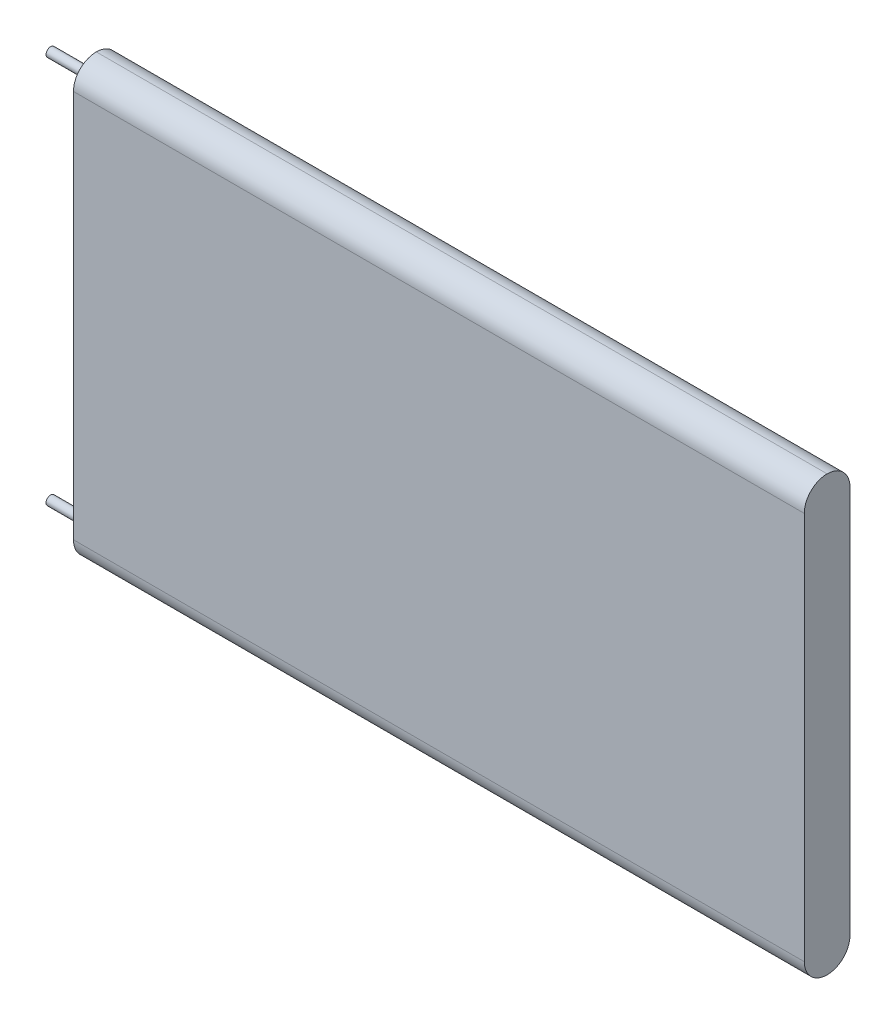
ISO-10303-21;
HEADER;
FILE_DESCRIPTION(('STEP AP214'),'2;1');
FILE_NAME('part.step','',(''),(''),'','','');
FILE_SCHEMA(('AUTOMOTIVE_DESIGN { 1 0 10303 214 1 1 1 1 }'));
ENDSEC;
DATA;
#1=APPLICATION_CONTEXT('core data for automotive mechanical design processes');
#2=APPLICATION_PROTOCOL_DEFINITION('international standard','automotive_design',2000,#1);
#3=PRODUCT_CONTEXT('',#1,'mechanical');
#4=PRODUCT('Part','Part','',(#3));
#5=PRODUCT_RELATED_PRODUCT_CATEGORY('part','',(#4));
#6=PRODUCT_DEFINITION_FORMATION('','',#4);
#7=PRODUCT_DEFINITION_CONTEXT('part definition',#1,'design');
#8=PRODUCT_DEFINITION('design','',#6,#7);
#9=PRODUCT_DEFINITION_SHAPE('','',#8);
#10=(LENGTH_UNIT() NAMED_UNIT(*) SI_UNIT(.MILLI.,.METRE.));
#11=(NAMED_UNIT(*) PLANE_ANGLE_UNIT() SI_UNIT($,.RADIAN.));
#12=(NAMED_UNIT(*) SI_UNIT($,.STERADIAN.) SOLID_ANGLE_UNIT());
#13=UNCERTAINTY_MEASURE_WITH_UNIT(LENGTH_MEASURE(1.E-05),#10,'distance_accuracy_value','');
#14=(GEOMETRIC_REPRESENTATION_CONTEXT(3) GLOBAL_UNCERTAINTY_ASSIGNED_CONTEXT((#13)) GLOBAL_UNIT_ASSIGNED_CONTEXT((#10,
#11,#12)) REPRESENTATION_CONTEXT('',''));
#15=CARTESIAN_POINT('',(0.,0.,0.));
#16=DIRECTION('',(0.,0.,1.));
#17=DIRECTION('',(1.,0.,0.));
#18=AXIS2_PLACEMENT_3D('',#15,#16,#17);
#19=CARTESIAN_POINT('',(50.8,-30.1625,6.35));
#20=DIRECTION('',(-1.,0.,0.));
#21=DIRECTION('',(0.,0.,1.));
#22=AXIS2_PLACEMENT_3D('',#19,#20,#21);
#23=PLANE('',#22);
#24=CARTESIAN_POINT('',(50.8,26.9875,3.175));
#25=DIRECTION('',(-1.,0.,0.));
#26=DIRECTION('',(0.,0.,1.));
#27=AXIS2_PLACEMENT_3D('',#24,#25,#26);
#28=CIRCLE('',#27,3.175);
#29=CARTESIAN_POINT('',(50.8,26.9875,0.));
#30=VERTEX_POINT('',#29);
#31=CARTESIAN_POINT('',(50.8,30.1625,3.175));
#32=VERTEX_POINT('',#31);
#33=EDGE_CURVE('E57',#30,#32,#28,.F.);
#34=ORIENTED_EDGE('',*,*,#33,.T.);
#35=CARTESIAN_POINT('',(50.8,26.9875,3.175));
#36=DIRECTION('',(-1.,0.,0.));
#37=DIRECTION('',(0.,0.,1.));
#38=AXIS2_PLACEMENT_3D('',#35,#36,#37);
#39=CIRCLE('',#38,3.175);
#40=CARTESIAN_POINT('',(50.8,26.9875,6.35));
#41=VERTEX_POINT('',#40);
#42=EDGE_CURVE('E108',#32,#41,#39,.F.);
#43=ORIENTED_EDGE('',*,*,#42,.T.);
#44=DIRECTION('',(0.,1.,0.));
#45=VECTOR('',#44,1.);
#46=CARTESIAN_POINT('',(50.8,-30.1625,6.35));
#47=LINE('',#46,#45);
#48=CARTESIAN_POINT('',(50.8,-26.9875,6.35));
#49=VERTEX_POINT('',#48);
#50=EDGE_CURVE('E101',#49,#41,#47,.T.);
#51=ORIENTED_EDGE('',*,*,#50,.F.);
#52=CARTESIAN_POINT('',(50.8,-26.9875,3.175));
#53=DIRECTION('',(-1.,0.,0.));
#54=DIRECTION('',(0.,0.,1.));
#55=AXIS2_PLACEMENT_3D('',#52,#53,#54);
#56=CIRCLE('',#55,3.175);
#57=CARTESIAN_POINT('',(50.8,-30.1625,3.175));
#58=VERTEX_POINT('',#57);
#59=EDGE_CURVE('E50',#49,#58,#56,.F.);
#60=ORIENTED_EDGE('',*,*,#59,.T.);
#61=CARTESIAN_POINT('',(50.8,-26.9875,3.175));
#62=DIRECTION('',(-1.,0.,0.));
#63=DIRECTION('',(0.,0.,1.));
#64=AXIS2_PLACEMENT_3D('',#61,#62,#63);
#65=CIRCLE('',#64,3.175);
#66=CARTESIAN_POINT('',(50.8,-26.9875,0.));
#67=VERTEX_POINT('',#66);
#68=EDGE_CURVE('E94',#58,#67,#65,.F.);
#69=ORIENTED_EDGE('',*,*,#68,.T.);
#70=DIRECTION('',(0.,1.,0.));
#71=VECTOR('',#70,1.);
#72=CARTESIAN_POINT('',(50.8,-30.1625,0.));
#73=LINE('',#72,#71);
#74=EDGE_CURVE('E113',#67,#30,#73,.T.);
#75=ORIENTED_EDGE('',*,*,#74,.T.);
#76=EDGE_LOOP('',(#34,#43,#51,#60,#69,#75));
#77=FACE_BOUND('',#76,.T.);
#78=ADVANCED_FACE('F35',(#77),#23,.F.);
#79=CARTESIAN_POINT('',(-50.8,-30.1625,6.35));
#80=DIRECTION('',(1.,0.,0.));
#81=DIRECTION('',(0.,0.,-1.));
#82=AXIS2_PLACEMENT_3D('',#79,#80,#81);
#83=PLANE('',#82);
#84=CARTESIAN_POINT('',(-50.8,-26.9875,3.175));
#85=DIRECTION('',(1.,0.,0.));
#86=DIRECTION('',(0.,0.,-1.));
#87=AXIS2_PLACEMENT_3D('',#84,#85,#86);
#88=CIRCLE('',#87,0.635);
#89=CARTESIAN_POINT('',(-50.8,-26.9875,2.54));
#90=VERTEX_POINT('',#89);
#91=EDGE_CURVE('E11',#90,#90,#88,.F.);
#92=ORIENTED_EDGE('',*,*,#91,.F.);
#93=EDGE_LOOP('',(#92));
#94=FACE_BOUND('',#93,.T.);
#95=CARTESIAN_POINT('',(-50.8,26.9875,3.175));
#96=DIRECTION('',(1.,0.,0.));
#97=DIRECTION('',(0.,0.,-1.));
#98=AXIS2_PLACEMENT_3D('',#95,#96,#97);
#99=CIRCLE('',#98,0.635);
#100=CARTESIAN_POINT('',(-50.8,26.9875,2.54));
#101=VERTEX_POINT('',#100);
#102=EDGE_CURVE('E43',#101,#101,#99,.F.);
#103=ORIENTED_EDGE('',*,*,#102,.F.);
#104=EDGE_LOOP('',(#103));
#105=FACE_BOUND('',#104,.T.);
#106=DIRECTION('',(0.,-1.,0.));
#107=VECTOR('',#106,1.);
#108=CARTESIAN_POINT('',(-50.8,-30.1625,6.35));
#109=LINE('',#108,#107);
#110=CARTESIAN_POINT('',(-50.8,26.9875,6.35));
#111=VERTEX_POINT('',#110);
#112=CARTESIAN_POINT('',(-50.8,-26.9875,6.35));
#113=VERTEX_POINT('',#112);
#114=EDGE_CURVE('E104',#111,#113,#109,.T.);
#115=ORIENTED_EDGE('',*,*,#114,.F.);
#116=CARTESIAN_POINT('',(-50.8,26.9875,3.175));
#117=DIRECTION('',(1.,0.,0.));
#118=DIRECTION('',(0.,0.,-1.));
#119=AXIS2_PLACEMENT_3D('',#116,#117,#118);
#120=CIRCLE('',#119,3.175);
#121=CARTESIAN_POINT('',(-50.8,30.1625,3.175));
#122=VERTEX_POINT('',#121);
#123=EDGE_CURVE('E128',#111,#122,#120,.F.);
#124=ORIENTED_EDGE('',*,*,#123,.T.);
#125=CARTESIAN_POINT('',(-50.8,26.9875,3.175));
#126=DIRECTION('',(1.,0.,0.));
#127=DIRECTION('',(0.,0.,-1.));
#128=AXIS2_PLACEMENT_3D('',#125,#126,#127);
#129=CIRCLE('',#128,3.175);
#130=CARTESIAN_POINT('',(-50.8,26.9875,0.));
#131=VERTEX_POINT('',#130);
#132=EDGE_CURVE('E126',#122,#131,#129,.F.);
#133=ORIENTED_EDGE('',*,*,#132,.T.);
#134=DIRECTION('',(0.,-1.,0.));
#135=VECTOR('',#134,1.);
#136=CARTESIAN_POINT('',(-50.8,-30.1625,0.));
#137=LINE('',#136,#135);
#138=CARTESIAN_POINT('',(-50.8,-26.9875,0.));
#139=VERTEX_POINT('',#138);
#140=EDGE_CURVE('E109',#131,#139,#137,.T.);
#141=ORIENTED_EDGE('',*,*,#140,.T.);
#142=CARTESIAN_POINT('',(-50.8,-26.9875,3.175));
#143=DIRECTION('',(1.,0.,0.));
#144=DIRECTION('',(0.,0.,-1.));
#145=AXIS2_PLACEMENT_3D('',#142,#143,#144);
#146=CIRCLE('',#145,3.175);
#147=CARTESIAN_POINT('',(-50.8,-30.1625,3.175));
#148=VERTEX_POINT('',#147);
#149=EDGE_CURVE('E122',#139,#148,#146,.F.);
#150=ORIENTED_EDGE('',*,*,#149,.T.);
#151=CARTESIAN_POINT('',(-50.8,-26.9875,3.175));
#152=DIRECTION('',(1.,0.,0.));
#153=DIRECTION('',(0.,0.,-1.));
#154=AXIS2_PLACEMENT_3D('',#151,#152,#153);
#155=CIRCLE('',#154,3.175);
#156=EDGE_CURVE('E124',#148,#113,#155,.F.);
#157=ORIENTED_EDGE('',*,*,#156,.T.);
#158=EDGE_LOOP('',(#115,#124,#133,#141,#150,#157));
#159=FACE_BOUND('',#158,.T.);
#160=ADVANCED_FACE('F144',(#94,#105,#159),#83,.F.);
#161=CARTESIAN_POINT('',(0.,0.,6.35));
#162=DIRECTION('',(0.,0.,-1.));
#163=DIRECTION('',(-1.,0.,0.));
#164=AXIS2_PLACEMENT_3D('',#161,#162,#163);
#165=PLANE('',#164);
#166=ORIENTED_EDGE('',*,*,#50,.T.);
#167=DIRECTION('',(-1.,0.,0.));
#168=VECTOR('',#167,1.);
#169=CARTESIAN_POINT('',(0.,26.9875,6.35));
#170=LINE('',#169,#168);
#171=EDGE_CURVE('E105',#41,#111,#170,.T.);
#172=ORIENTED_EDGE('',*,*,#171,.T.);
#173=ORIENTED_EDGE('',*,*,#114,.T.);
#174=DIRECTION('',(1.,0.,0.));
#175=VECTOR('',#174,1.);
#176=CARTESIAN_POINT('',(0.,-26.9875,6.35));
#177=LINE('',#176,#175);
#178=EDGE_CURVE('E91',#113,#49,#177,.T.);
#179=ORIENTED_EDGE('',*,*,#178,.T.);
#180=EDGE_LOOP('',(#166,#172,#173,#179));
#181=FACE_BOUND('',#180,.T.);
#182=ADVANCED_FACE('F99',(#181),#165,.F.);
#183=CARTESIAN_POINT('',(0.,0.,0.));
#184=DIRECTION('',(0.,0.,-1.));
#185=DIRECTION('',(-1.,0.,0.));
#186=AXIS2_PLACEMENT_3D('',#183,#184,#185);
#187=PLANE('',#186);
#188=ORIENTED_EDGE('',*,*,#140,.F.);
#189=DIRECTION('',(-1.,0.,0.));
#190=VECTOR('',#189,1.);
#191=CARTESIAN_POINT('',(50.8,26.9875,0.));
#192=LINE('',#191,#190);
#193=EDGE_CURVE('E135',#131,#30,#192,.F.);
#194=ORIENTED_EDGE('',*,*,#193,.T.);
#195=ORIENTED_EDGE('',*,*,#74,.F.);
#196=DIRECTION('',(1.,0.,0.));
#197=VECTOR('',#196,1.);
#198=CARTESIAN_POINT('',(-50.8,-26.9875,0.));
#199=LINE('',#198,#197);
#200=EDGE_CURVE('E133',#67,#139,#199,.F.);
#201=ORIENTED_EDGE('',*,*,#200,.T.);
#202=EDGE_LOOP('',(#188,#194,#195,#201));
#203=FACE_BOUND('',#202,.T.);
#204=ADVANCED_FACE('F156',(#203),#187,.T.);
#205=CARTESIAN_POINT('',(-50.8,26.9875,3.175));
#206=DIRECTION('',(1.,0.,0.));
#207=DIRECTION('',(0.,0.,-1.));
#208=AXIS2_PLACEMENT_3D('',#205,#206,#207);
#209=CYLINDRICAL_SURFACE('',#208,3.175);
#210=DIRECTION('',(-1.,0.,0.));
#211=VECTOR('',#210,1.);
#212=CARTESIAN_POINT('',(-50.8,30.1625,3.175));
#213=LINE('',#212,#211);
#214=EDGE_CURVE('E119',#32,#122,#213,.T.);
#215=ORIENTED_EDGE('',*,*,#214,.F.);
#216=ORIENTED_EDGE('',*,*,#33,.F.);
#217=ORIENTED_EDGE('',*,*,#193,.F.);
#218=ORIENTED_EDGE('',*,*,#132,.F.);
#219=EDGE_LOOP('',(#215,#216,#217,#218));
#220=FACE_BOUND('',#219,.T.);
#221=ADVANCED_FACE('F159',(#220),#209,.T.);
#222=CARTESIAN_POINT('',(0.,26.9875,3.175));
#223=DIRECTION('',(-1.,0.,0.));
#224=DIRECTION('',(0.,0.,1.));
#225=AXIS2_PLACEMENT_3D('',#222,#223,#224);
#226=CYLINDRICAL_SURFACE('',#225,3.175);
#227=ORIENTED_EDGE('',*,*,#42,.F.);
#228=ORIENTED_EDGE('',*,*,#214,.T.);
#229=ORIENTED_EDGE('',*,*,#123,.F.);
#230=ORIENTED_EDGE('',*,*,#171,.F.);
#231=EDGE_LOOP('',(#227,#228,#229,#230));
#232=FACE_BOUND('',#231,.T.);
#233=ADVANCED_FACE('F161',(#232),#226,.T.);
#234=CARTESIAN_POINT('',(-50.8,-26.9875,3.175));
#235=DIRECTION('',(-1.,0.,0.));
#236=DIRECTION('',(0.,0.,1.));
#237=AXIS2_PLACEMENT_3D('',#234,#235,#236);
#238=CYLINDRICAL_SURFACE('',#237,3.175);
#239=DIRECTION('',(1.,0.,0.));
#240=VECTOR('',#239,1.);
#241=CARTESIAN_POINT('',(50.8,-30.1625,3.175));
#242=LINE('',#241,#240);
#243=EDGE_CURVE('E93',#148,#58,#242,.T.);
#244=ORIENTED_EDGE('',*,*,#243,.F.);
#245=ORIENTED_EDGE('',*,*,#149,.F.);
#246=ORIENTED_EDGE('',*,*,#200,.F.);
#247=ORIENTED_EDGE('',*,*,#68,.F.);
#248=EDGE_LOOP('',(#244,#245,#246,#247));
#249=FACE_BOUND('',#248,.T.);
#250=ADVANCED_FACE('F37',(#249),#238,.T.);
#251=CARTESIAN_POINT('',(0.,-26.9875,3.175));
#252=DIRECTION('',(1.,0.,0.));
#253=DIRECTION('',(0.,0.,-1.));
#254=AXIS2_PLACEMENT_3D('',#251,#252,#253);
#255=CYLINDRICAL_SURFACE('',#254,3.175);
#256=ORIENTED_EDGE('',*,*,#156,.F.);
#257=ORIENTED_EDGE('',*,*,#243,.T.);
#258=ORIENTED_EDGE('',*,*,#59,.F.);
#259=ORIENTED_EDGE('',*,*,#178,.F.);
#260=EDGE_LOOP('',(#256,#257,#258,#259));
#261=FACE_BOUND('',#260,.T.);
#262=ADVANCED_FACE('F90',(#261),#255,.T.);
#263=CARTESIAN_POINT('',(-57.15,26.9875,3.175));
#264=DIRECTION('',(1.,0.,0.));
#265=DIRECTION('',(0.,0.,-1.));
#266=AXIS2_PLACEMENT_3D('',#263,#264,#265);
#267=CYLINDRICAL_SURFACE('',#266,0.635);
#268=CARTESIAN_POINT('',(-57.15,26.9875,3.175));
#269=DIRECTION('',(-1.,0.,0.));
#270=DIRECTION('',(0.,0.,1.));
#271=AXIS2_PLACEMENT_3D('',#268,#269,#270);
#272=CIRCLE('',#271,0.635);
#273=CARTESIAN_POINT('',(-57.15,26.9875,3.81));
#274=VERTEX_POINT('',#273);
#275=EDGE_CURVE('E116',#274,#274,#272,.T.);
#276=ORIENTED_EDGE('',*,*,#275,.F.);
#277=EDGE_LOOP('',(#276));
#278=FACE_BOUND('',#277,.T.);
#279=ORIENTED_EDGE('',*,*,#102,.T.);
#280=EDGE_LOOP('',(#279));
#281=FACE_BOUND('',#280,.T.);
#282=ADVANCED_FACE('F142',(#278,#281),#267,.T.);
#283=CARTESIAN_POINT('',(-57.15,26.9875,3.175));
#284=DIRECTION('',(-1.,0.,0.));
#285=DIRECTION('',(0.,0.,1.));
#286=AXIS2_PLACEMENT_3D('',#283,#284,#285);
#287=PLANE('',#286);
#288=ORIENTED_EDGE('',*,*,#275,.T.);
#289=EDGE_LOOP('',(#288));
#290=FACE_BOUND('',#289,.T.);
#291=ADVANCED_FACE('F180',(#290),#287,.T.);
#292=CARTESIAN_POINT('',(-57.15,-26.9875,3.175));
#293=DIRECTION('',(1.,0.,0.));
#294=DIRECTION('',(0.,0.,-1.));
#295=AXIS2_PLACEMENT_3D('',#292,#293,#294);
#296=CYLINDRICAL_SURFACE('',#295,0.635);
#297=CARTESIAN_POINT('',(-57.15,-26.9875,3.175));
#298=DIRECTION('',(-1.,0.,0.));
#299=DIRECTION('',(0.,0.,1.));
#300=AXIS2_PLACEMENT_3D('',#297,#298,#299);
#301=CIRCLE('',#300,0.635);
#302=CARTESIAN_POINT('',(-57.15,-26.9875,3.81));
#303=VERTEX_POINT('',#302);
#304=EDGE_CURVE('E196',#303,#303,#301,.T.);
#305=ORIENTED_EDGE('',*,*,#304,.F.);
#306=EDGE_LOOP('',(#305));
#307=FACE_BOUND('',#306,.T.);
#308=ORIENTED_EDGE('',*,*,#91,.T.);
#309=EDGE_LOOP('',(#308));
#310=FACE_BOUND('',#309,.T.);
#311=ADVANCED_FACE('F184',(#307,#310),#296,.T.);
#312=CARTESIAN_POINT('',(-57.15,-26.9875,3.175));
#313=DIRECTION('',(-1.,0.,0.));
#314=DIRECTION('',(0.,0.,1.));
#315=AXIS2_PLACEMENT_3D('',#312,#313,#314);
#316=PLANE('',#315);
#317=ORIENTED_EDGE('',*,*,#304,.T.);
#318=EDGE_LOOP('',(#317));
#319=FACE_BOUND('',#318,.T.);
#320=ADVANCED_FACE('F188',(#319),#316,.T.);
#321=CLOSED_SHELL('',(#78,#160,#182,#204,#221,#233,#250,#262,#282,#291,#311,#320));
#322=MANIFOLD_SOLID_BREP('B2',#321);
#323=ADVANCED_BREP_SHAPE_REPRESENTATION('',(#18,#322),#14);
#324=SHAPE_DEFINITION_REPRESENTATION(#9,#323);
ENDSEC;
END-ISO-10303-21;
